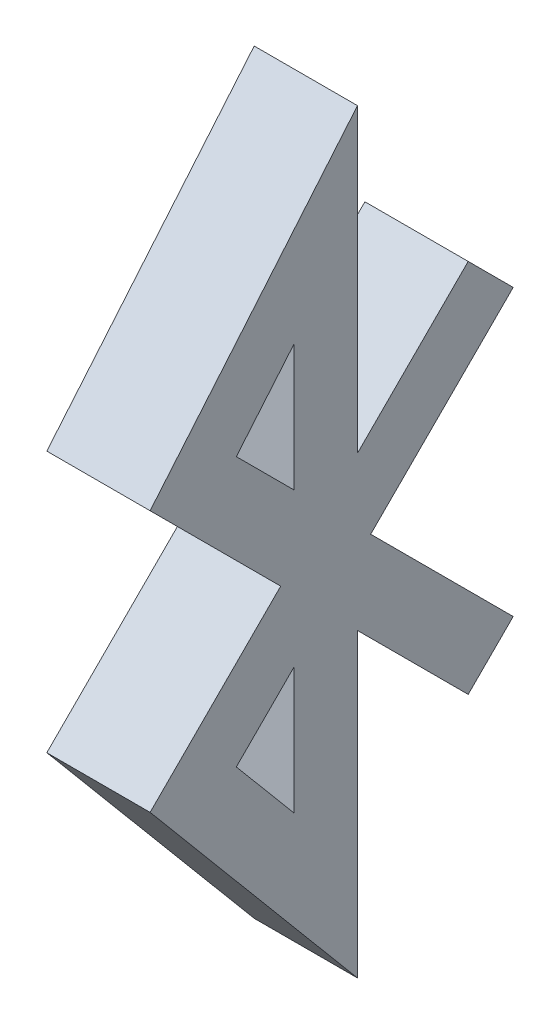
ISO-10303-21;
HEADER;
FILE_DESCRIPTION(('STEP AP214'),'2;1');
FILE_NAME('part.step','',(''),(''),'','','');
FILE_SCHEMA(('AUTOMOTIVE_DESIGN { 1 0 10303 214 1 1 1 1 }'));
ENDSEC;
DATA;
#1=APPLICATION_CONTEXT('core data for automotive mechanical design processes');
#2=APPLICATION_PROTOCOL_DEFINITION('international standard','automotive_design',2000,#1);
#3=PRODUCT_CONTEXT('',#1,'mechanical');
#4=PRODUCT('Part','Part','',(#3));
#5=PRODUCT_RELATED_PRODUCT_CATEGORY('part','',(#4));
#6=PRODUCT_DEFINITION_FORMATION('','',#4);
#7=PRODUCT_DEFINITION_CONTEXT('part definition',#1,'design');
#8=PRODUCT_DEFINITION('design','',#6,#7);
#9=PRODUCT_DEFINITION_SHAPE('','',#8);
#10=(LENGTH_UNIT() NAMED_UNIT(*) SI_UNIT(.MILLI.,.METRE.));
#11=(NAMED_UNIT(*) PLANE_ANGLE_UNIT() SI_UNIT($,.RADIAN.));
#12=(NAMED_UNIT(*) SI_UNIT($,.STERADIAN.) SOLID_ANGLE_UNIT());
#13=UNCERTAINTY_MEASURE_WITH_UNIT(LENGTH_MEASURE(1.E-05),#10,'distance_accuracy_value','');
#14=(GEOMETRIC_REPRESENTATION_CONTEXT(3) GLOBAL_UNCERTAINTY_ASSIGNED_CONTEXT((#13)) GLOBAL_UNIT_ASSIGNED_CONTEXT((#10,
#11,#12)) REPRESENTATION_CONTEXT('',''));
#15=CARTESIAN_POINT('',(0.,0.,0.));
#16=DIRECTION('',(0.,0.,1.));
#17=DIRECTION('',(1.,0.,0.));
#18=AXIS2_PLACEMENT_3D('',#15,#16,#17);
#19=CARTESIAN_POINT('',(-97.7869829373561,38.7791698484324,-0.465579749400182));
#20=DIRECTION('',(0.,0.,-1.));
#21=DIRECTION('',(-1.,0.,0.));
#22=AXIS2_PLACEMENT_3D('',#19,#20,#21);
#23=PLANE('',#22);
#24=DIRECTION('',(0.,-1.,0.));
#25=VECTOR('',#24,1.);
#26=CARTESIAN_POINT('',(-99.299,38.7791698484324,-0.465579749400182));
#27=LINE('',#26,#25);
#28=CARTESIAN_POINT('',(-99.299,38.7791698484324,-0.465579749400182));
#29=VERTEX_POINT('',#28);
#30=CARTESIAN_POINT('',(-99.299,34.3740089453682,-0.465579749400176));
#31=VERTEX_POINT('',#30);
#32=EDGE_CURVE('E194',#29,#31,#27,.T.);
#33=ORIENTED_EDGE('',*,*,#32,.F.);
#34=DIRECTION('',(-1.,0.,0.));
#35=VECTOR('',#34,1.);
#36=CARTESIAN_POINT('',(-97.7869829373561,38.7791698484324,-0.465579749400182));
#37=LINE('',#36,#35);
#38=CARTESIAN_POINT('',(-97.7869829373561,38.7791698484324,-0.465579749400182));
#39=VERTEX_POINT('',#38);
#40=EDGE_CURVE('E35',#39,#29,#37,.T.);
#41=ORIENTED_EDGE('',*,*,#40,.F.);
#42=DIRECTION('',(0.,-1.,0.));
#43=VECTOR('',#42,1.);
#44=CARTESIAN_POINT('',(-97.7869829373561,38.7791698484324,-0.465579749400182));
#45=LINE('',#44,#43);
#46=CARTESIAN_POINT('',(-97.7869829373561,34.3740089453682,-0.465579749400176));
#47=VERTEX_POINT('',#46);
#48=EDGE_CURVE('E280',#39,#47,#45,.T.);
#49=ORIENTED_EDGE('',*,*,#48,.T.);
#50=DIRECTION('',(-1.,0.,0.));
#51=VECTOR('',#50,1.);
#52=CARTESIAN_POINT('',(-97.7869829373561,34.3740089453682,-0.465579749400176));
#53=LINE('',#52,#51);
#54=EDGE_CURVE('E10',#47,#31,#53,.T.);
#55=ORIENTED_EDGE('',*,*,#54,.T.);
#56=EDGE_LOOP('',(#33,#41,#49,#55));
#57=FACE_BOUND('',#56,.T.);
#58=ADVANCED_FACE('F16',(#57),#23,.T.);
#59=CARTESIAN_POINT('',(-97.7869829373561,34.3740089453682,-0.465579749400176));
#60=DIRECTION('',(0.,0.707106781186544,0.707106781186551));
#61=DIRECTION('',(0.,-0.707106781186551,0.707106781186544));
#62=AXIS2_PLACEMENT_3D('',#59,#60,#61);
#63=PLANE('',#62);
#64=DIRECTION('',(0.,0.707106781186551,-0.707106781186544));
#65=VECTOR('',#64,1.);
#66=CARTESIAN_POINT('',(-99.299,34.3740089453682,-0.465579749400176));
#67=LINE('',#66,#65);
#68=CARTESIAN_POINT('',(-99.299,35.9943942004683,-2.0859650045003));
#69=VERTEX_POINT('',#68);
#70=EDGE_CURVE('E197',#31,#69,#67,.T.);
#71=ORIENTED_EDGE('',*,*,#70,.F.);
#72=ORIENTED_EDGE('',*,*,#54,.F.);
#73=DIRECTION('',(0.,0.707106781186551,-0.707106781186544));
#74=VECTOR('',#73,1.);
#75=CARTESIAN_POINT('',(-97.7869829373561,34.3740089453682,-0.465579749400176));
#76=LINE('',#75,#74);
#77=CARTESIAN_POINT('',(-97.7869829373561,35.9943942004683,-2.0859650045003));
#78=VERTEX_POINT('',#77);
#79=EDGE_CURVE('E282',#47,#78,#76,.T.);
#80=ORIENTED_EDGE('',*,*,#79,.T.);
#81=DIRECTION('',(-1.,0.,0.));
#82=VECTOR('',#81,1.);
#83=CARTESIAN_POINT('',(-97.7869829373561,35.9943942004683,-2.0859650045003));
#84=LINE('',#83,#82);
#85=EDGE_CURVE('E26',#78,#69,#84,.T.);
#86=ORIENTED_EDGE('',*,*,#85,.T.);
#87=EDGE_LOOP('',(#71,#72,#80,#86));
#88=FACE_BOUND('',#87,.T.);
#89=ADVANCED_FACE('F332',(#88),#63,.T.);
#90=CARTESIAN_POINT('',(-97.7869829373561,35.9943942004683,-2.0859650045003));
#91=DIRECTION('',(0.,0.707106781186551,-0.707106781186544));
#92=DIRECTION('',(0.,0.707106781186544,0.707106781186551));
#93=AXIS2_PLACEMENT_3D('',#90,#91,#92);
#94=PLANE('',#93);
#95=DIRECTION('',(0.,-0.707106781186544,-0.707106781186551));
#96=VECTOR('',#95,1.);
#97=CARTESIAN_POINT('',(-99.299,35.9943942004683,-2.0859650045003));
#98=LINE('',#97,#96);
#99=CARTESIAN_POINT('',(-99.299,35.3359650045003,-2.7443942004683));
#100=VERTEX_POINT('',#99);
#101=EDGE_CURVE('E200',#69,#100,#98,.T.);
#102=ORIENTED_EDGE('',*,*,#101,.F.);
#103=ORIENTED_EDGE('',*,*,#85,.F.);
#104=DIRECTION('',(0.,-0.707106781186544,-0.707106781186551));
#105=VECTOR('',#104,1.);
#106=CARTESIAN_POINT('',(-97.7869829373561,35.9943942004683,-2.0859650045003));
#107=LINE('',#106,#105);
#108=CARTESIAN_POINT('',(-97.7869829373561,35.3359650045003,-2.7443942004683));
#109=VERTEX_POINT('',#108);
#110=EDGE_CURVE('E285',#78,#109,#107,.T.);
#111=ORIENTED_EDGE('',*,*,#110,.T.);
#112=DIRECTION('',(-1.,0.,0.));
#113=VECTOR('',#112,1.);
#114=CARTESIAN_POINT('',(-97.7869829373561,35.3359650045003,-2.7443942004683));
#115=LINE('',#114,#113);
#116=EDGE_CURVE('E241',#109,#100,#115,.T.);
#117=ORIENTED_EDGE('',*,*,#116,.T.);
#118=EDGE_LOOP('',(#102,#103,#111,#117));
#119=FACE_BOUND('',#118,.T.);
#120=ADVANCED_FACE('F328',(#119),#94,.T.);
#121=CARTESIAN_POINT('',(-97.7869829373561,35.3359650045003,-2.7443942004683));
#122=DIRECTION('',(0.,-0.707106781186544,-0.707106781186551));
#123=DIRECTION('',(0.,0.707106781186551,-0.707106781186544));
#124=AXIS2_PLACEMENT_3D('',#121,#122,#123);
#125=PLANE('',#124);
#126=DIRECTION('',(0.,-0.707106781186551,0.707106781186544));
#127=VECTOR('',#126,1.);
#128=CARTESIAN_POINT('',(-99.299,35.3359650045003,-2.7443942004683));
#129=LINE('',#128,#127);
#130=CARTESIAN_POINT('',(-99.299,33.25,-0.658429195968));
#131=VERTEX_POINT('',#130);
#132=EDGE_CURVE('E203',#100,#131,#129,.T.);
#133=ORIENTED_EDGE('',*,*,#132,.F.);
#134=ORIENTED_EDGE('',*,*,#116,.F.);
#135=DIRECTION('',(0.,-0.707106781186551,0.707106781186544));
#136=VECTOR('',#135,1.);
#137=CARTESIAN_POINT('',(-97.7869829373561,35.3359650045003,-2.7443942004683));
#138=LINE('',#137,#136);
#139=CARTESIAN_POINT('',(-97.7869829373561,33.25,-0.658429195968001));
#140=VERTEX_POINT('',#139);
#141=EDGE_CURVE('E288',#109,#140,#138,.T.);
#142=ORIENTED_EDGE('',*,*,#141,.T.);
#143=DIRECTION('',(-1.,0.,0.));
#144=VECTOR('',#143,1.);
#145=CARTESIAN_POINT('',(-97.7869829373561,33.25,-0.658429195968001));
#146=LINE('',#145,#144);
#147=EDGE_CURVE('E239',#140,#131,#146,.T.);
#148=ORIENTED_EDGE('',*,*,#147,.T.);
#149=EDGE_LOOP('',(#133,#134,#142,#148));
#150=FACE_BOUND('',#149,.T.);
#151=ADVANCED_FACE('F325',(#150),#125,.T.);
#152=CARTESIAN_POINT('',(-97.7869829373561,33.25,-0.658429195968001));
#153=DIRECTION('',(0.,0.707106781186551,-0.707106781186544));
#154=DIRECTION('',(0.,0.707106781186544,0.707106781186551));
#155=AXIS2_PLACEMENT_3D('',#152,#153,#154);
#156=PLANE('',#155);
#157=DIRECTION('',(0.,-0.707106781186544,-0.707106781186551));
#158=VECTOR('',#157,1.);
#159=CARTESIAN_POINT('',(-99.299,33.25,-0.658429195968));
#160=LINE('',#159,#158);
#161=CARTESIAN_POINT('',(-99.299,31.1640349954997,-2.7443942004683));
#162=VERTEX_POINT('',#161);
#163=EDGE_CURVE('E206',#131,#162,#160,.T.);
#164=ORIENTED_EDGE('',*,*,#163,.F.);
#165=ORIENTED_EDGE('',*,*,#147,.F.);
#166=DIRECTION('',(0.,-0.707106781186544,-0.707106781186551));
#167=VECTOR('',#166,1.);
#168=CARTESIAN_POINT('',(-97.7869829373561,33.25,-0.658429195968001));
#169=LINE('',#168,#167);
#170=CARTESIAN_POINT('',(-97.7869829373561,31.1640349954997,-2.7443942004683));
#171=VERTEX_POINT('',#170);
#172=EDGE_CURVE('E291',#140,#171,#169,.T.);
#173=ORIENTED_EDGE('',*,*,#172,.T.);
#174=DIRECTION('',(-1.,0.,0.));
#175=VECTOR('',#174,1.);
#176=CARTESIAN_POINT('',(-97.7869829373561,31.1640349954997,-2.7443942004683));
#177=LINE('',#176,#175);
#178=EDGE_CURVE('E237',#171,#162,#177,.T.);
#179=ORIENTED_EDGE('',*,*,#178,.T.);
#180=EDGE_LOOP('',(#164,#165,#173,#179));
#181=FACE_BOUND('',#180,.T.);
#182=ADVANCED_FACE('F322',(#181),#156,.T.);
#183=CARTESIAN_POINT('',(-97.7869829373561,31.1640349954997,-2.7443942004683));
#184=DIRECTION('',(0.,-0.707106781186544,-0.707106781186551));
#185=DIRECTION('',(0.,0.707106781186551,-0.707106781186544));
#186=AXIS2_PLACEMENT_3D('',#183,#184,#185);
#187=PLANE('',#186);
#188=DIRECTION('',(0.,-0.707106781186551,0.707106781186544));
#189=VECTOR('',#188,1.);
#190=CARTESIAN_POINT('',(-99.299,31.1640349954997,-2.7443942004683));
#191=LINE('',#190,#189);
#192=CARTESIAN_POINT('',(-99.299,30.5056057995317,-2.0859650045003));
#193=VERTEX_POINT('',#192);
#194=EDGE_CURVE('E209',#162,#193,#191,.T.);
#195=ORIENTED_EDGE('',*,*,#194,.F.);
#196=ORIENTED_EDGE('',*,*,#178,.F.);
#197=DIRECTION('',(0.,-0.707106781186551,0.707106781186544));
#198=VECTOR('',#197,1.);
#199=CARTESIAN_POINT('',(-97.7869829373561,31.1640349954997,-2.7443942004683));
#200=LINE('',#199,#198);
#201=CARTESIAN_POINT('',(-97.7869829373561,30.5056057995317,-2.0859650045003));
#202=VERTEX_POINT('',#201);
#203=EDGE_CURVE('E294',#171,#202,#200,.T.);
#204=ORIENTED_EDGE('',*,*,#203,.T.);
#205=DIRECTION('',(-1.,0.,0.));
#206=VECTOR('',#205,1.);
#207=CARTESIAN_POINT('',(-97.7869829373561,30.5056057995317,-2.0859650045003));
#208=LINE('',#207,#206);
#209=EDGE_CURVE('E235',#202,#193,#208,.T.);
#210=ORIENTED_EDGE('',*,*,#209,.T.);
#211=EDGE_LOOP('',(#195,#196,#204,#210));
#212=FACE_BOUND('',#211,.T.);
#213=ADVANCED_FACE('F316',(#212),#187,.T.);
#214=CARTESIAN_POINT('',(-97.7869829373561,30.5056057995317,-2.0859650045003));
#215=DIRECTION('',(0.,-0.707106781186551,0.707106781186544));
#216=DIRECTION('',(0.,-0.707106781186544,-0.707106781186551));
#217=AXIS2_PLACEMENT_3D('',#214,#215,#216);
#218=PLANE('',#217);
#219=DIRECTION('',(0.,0.707106781186544,0.707106781186551));
#220=VECTOR('',#219,1.);
#221=CARTESIAN_POINT('',(-99.299,30.5056057995317,-2.0859650045003));
#222=LINE('',#221,#220);
#223=CARTESIAN_POINT('',(-99.299,32.1259910546318,-0.46557974940018));
#224=VERTEX_POINT('',#223);
#225=EDGE_CURVE('E212',#193,#224,#222,.T.);
#226=ORIENTED_EDGE('',*,*,#225,.F.);
#227=ORIENTED_EDGE('',*,*,#209,.F.);
#228=DIRECTION('',(0.,0.707106781186544,0.707106781186551));
#229=VECTOR('',#228,1.);
#230=CARTESIAN_POINT('',(-97.7869829373561,30.5056057995317,-2.0859650045003));
#231=LINE('',#230,#229);
#232=CARTESIAN_POINT('',(-97.7869829373561,32.1259910546318,-0.465579749400181));
#233=VERTEX_POINT('',#232);
#234=EDGE_CURVE('E297',#202,#233,#231,.T.);
#235=ORIENTED_EDGE('',*,*,#234,.T.);
#236=DIRECTION('',(-1.,0.,0.));
#237=VECTOR('',#236,1.);
#238=CARTESIAN_POINT('',(-97.7869829373561,32.1259910546318,-0.465579749400181));
#239=LINE('',#238,#237);
#240=EDGE_CURVE('E233',#233,#224,#239,.T.);
#241=ORIENTED_EDGE('',*,*,#240,.T.);
#242=EDGE_LOOP('',(#226,#227,#235,#241));
#243=FACE_BOUND('',#242,.T.);
#244=ADVANCED_FACE('F313',(#243),#218,.T.);
#245=CARTESIAN_POINT('',(-97.7869829373561,32.1259910546318,-0.465579749400181));
#246=DIRECTION('',(0.,0.,-1.));
#247=DIRECTION('',(-1.,0.,0.));
#248=AXIS2_PLACEMENT_3D('',#245,#246,#247);
#249=PLANE('',#248);
#250=DIRECTION('',(0.,-1.,0.));
#251=VECTOR('',#250,1.);
#252=CARTESIAN_POINT('',(-99.299,32.1259910546318,-0.46557974940018));
#253=LINE('',#252,#251);
#254=CARTESIAN_POINT('',(-99.299,27.7208301515677,-0.465579749400175));
#255=VERTEX_POINT('',#254);
#256=EDGE_CURVE('E215',#224,#255,#253,.T.);
#257=ORIENTED_EDGE('',*,*,#256,.F.);
#258=ORIENTED_EDGE('',*,*,#240,.F.);
#259=DIRECTION('',(0.,-1.,0.));
#260=VECTOR('',#259,1.);
#261=CARTESIAN_POINT('',(-97.7869829373561,32.1259910546318,-0.465579749400181));
#262=LINE('',#261,#260);
#263=CARTESIAN_POINT('',(-97.7869829373561,27.7208301515677,-0.465579749400175));
#264=VERTEX_POINT('',#263);
#265=EDGE_CURVE('E300',#233,#264,#262,.T.);
#266=ORIENTED_EDGE('',*,*,#265,.T.);
#267=DIRECTION('',(-1.,0.,0.));
#268=VECTOR('',#267,1.);
#269=CARTESIAN_POINT('',(-97.7869829373561,27.7208301515677,-0.465579749400175));
#270=LINE('',#269,#268);
#271=EDGE_CURVE('E231',#264,#255,#270,.T.);
#272=ORIENTED_EDGE('',*,*,#271,.T.);
#273=EDGE_LOOP('',(#257,#258,#266,#272));
#274=FACE_BOUND('',#273,.T.);
#275=ADVANCED_FACE('F310',(#274),#249,.T.);
#276=CARTESIAN_POINT('',(-97.7869829373561,27.7208301515677,-0.465579749400175));
#277=DIRECTION('',(0.,-0.642787609686541,0.766044443118976));
#278=DIRECTION('',(0.,-0.766044443118976,-0.642787609686541));
#279=AXIS2_PLACEMENT_3D('',#276,#277,#278);
#280=PLANE('',#279);
#281=DIRECTION('',(0.,0.766044443118976,0.642787609686541));
#282=VECTOR('',#281,1.);
#283=CARTESIAN_POINT('',(-99.299,27.7208301515677,-0.465579749400175));
#284=LINE('',#283,#282);
#285=CARTESIAN_POINT('',(-99.299,31.3384584089022,2.56997078706576));
#286=VERTEX_POINT('',#285);
#287=EDGE_CURVE('E218',#255,#286,#284,.T.);
#288=ORIENTED_EDGE('',*,*,#287,.F.);
#289=ORIENTED_EDGE('',*,*,#271,.F.);
#290=DIRECTION('',(0.,0.766044443118976,0.642787609686541));
#291=VECTOR('',#290,1.);
#292=CARTESIAN_POINT('',(-97.7869829373561,27.7208301515677,-0.465579749400175));
#293=LINE('',#292,#291);
#294=CARTESIAN_POINT('',(-97.7869829373561,31.3384584089022,2.56997078706576));
#295=VERTEX_POINT('',#294);
#296=EDGE_CURVE('E166',#264,#295,#293,.T.);
#297=ORIENTED_EDGE('',*,*,#296,.T.);
#298=DIRECTION('',(-1.,0.,0.));
#299=VECTOR('',#298,1.);
#300=CARTESIAN_POINT('',(-97.7869829373561,31.3384584089022,2.56997078706576));
#301=LINE('',#300,#299);
#302=EDGE_CURVE('E158',#295,#286,#301,.T.);
#303=ORIENTED_EDGE('',*,*,#302,.T.);
#304=EDGE_LOOP('',(#288,#289,#297,#303));
#305=FACE_BOUND('',#304,.T.);
#306=ADVANCED_FACE('F304',(#305),#280,.T.);
#307=CARTESIAN_POINT('',(-97.7869829373561,31.3384584089022,2.56997078706576));
#308=DIRECTION('',(0.,0.707106781186544,0.707106781186551));
#309=DIRECTION('',(0.,-0.707106781186551,0.707106781186544));
#310=AXIS2_PLACEMENT_3D('',#307,#308,#309);
#311=PLANE('',#310);
#312=DIRECTION('',(0.,0.707106781186551,-0.707106781186544));
#313=VECTOR('',#312,1.);
#314=CARTESIAN_POINT('',(-99.299,31.3384584089022,2.56997078706576));
#315=LINE('',#314,#313);
#316=CARTESIAN_POINT('',(-99.299,33.25,0.658429195968008));
#317=VERTEX_POINT('',#316);
#318=EDGE_CURVE('E221',#286,#317,#315,.T.);
#319=ORIENTED_EDGE('',*,*,#318,.F.);
#320=ORIENTED_EDGE('',*,*,#302,.F.);
#321=DIRECTION('',(0.,0.707106781186551,-0.707106781186544));
#322=VECTOR('',#321,1.);
#323=CARTESIAN_POINT('',(-97.7869829373561,31.3384584089022,2.56997078706576));
#324=LINE('',#323,#322);
#325=CARTESIAN_POINT('',(-97.7869829373561,33.25,0.658429195968007));
#326=VERTEX_POINT('',#325);
#327=EDGE_CURVE('E161',#295,#326,#324,.T.);
#328=ORIENTED_EDGE('',*,*,#327,.T.);
#329=DIRECTION('',(-1.,0.,0.));
#330=VECTOR('',#329,1.);
#331=CARTESIAN_POINT('',(-97.7869829373561,33.25,0.658429195968007));
#332=LINE('',#331,#330);
#333=EDGE_CURVE('E147',#326,#317,#332,.T.);
#334=ORIENTED_EDGE('',*,*,#333,.T.);
#335=EDGE_LOOP('',(#319,#320,#328,#334));
#336=FACE_BOUND('',#335,.T.);
#337=ADVANCED_FACE('F162',(#336),#311,.T.);
#338=CARTESIAN_POINT('',(-97.7869829373561,33.25,0.658429195968007));
#339=DIRECTION('',(0.,-0.707106781186551,0.707106781186544));
#340=DIRECTION('',(0.,-0.707106781186544,-0.707106781186551));
#341=AXIS2_PLACEMENT_3D('',#338,#339,#340);
#342=PLANE('',#341);
#343=DIRECTION('',(0.,0.707106781186544,0.707106781186551));
#344=VECTOR('',#343,1.);
#345=CARTESIAN_POINT('',(-99.299,33.25,0.658429195968008));
#346=LINE('',#345,#344);
#347=CARTESIAN_POINT('',(-99.299,35.1615415910978,2.56997078706577));
#348=VERTEX_POINT('',#347);
#349=EDGE_CURVE('E154',#317,#348,#346,.T.);
#350=ORIENTED_EDGE('',*,*,#349,.F.);
#351=ORIENTED_EDGE('',*,*,#333,.F.);
#352=DIRECTION('',(0.,0.707106781186544,0.707106781186551));
#353=VECTOR('',#352,1.);
#354=CARTESIAN_POINT('',(-97.7869829373561,33.25,0.658429195968007));
#355=LINE('',#354,#353);
#356=CARTESIAN_POINT('',(-97.7869829373561,35.1615415910978,2.56997078706577));
#357=VERTEX_POINT('',#356);
#358=EDGE_CURVE('E151',#326,#357,#355,.T.);
#359=ORIENTED_EDGE('',*,*,#358,.T.);
#360=DIRECTION('',(-1.,0.,0.));
#361=VECTOR('',#360,1.);
#362=CARTESIAN_POINT('',(-97.7869829373561,35.1615415910978,2.56997078706577));
#363=LINE('',#362,#361);
#364=EDGE_CURVE('E93',#357,#348,#363,.T.);
#365=ORIENTED_EDGE('',*,*,#364,.T.);
#366=EDGE_LOOP('',(#350,#351,#359,#365));
#367=FACE_BOUND('',#366,.T.);
#368=ADVANCED_FACE('F149',(#367),#342,.T.);
#369=CARTESIAN_POINT('',(-97.7869829373561,36.2208301515677,0.465579749400182));
#370=DIRECTION('',(0.,-0.642787609686535,-0.766044443118982));
#371=DIRECTION('',(0.,0.766044443118982,-0.642787609686535));
#372=AXIS2_PLACEMENT_3D('',#369,#370,#371);
#373=PLANE('',#372);
#374=DIRECTION('',(0.,-0.766044443118982,0.642787609686535));
#375=VECTOR('',#374,1.);
#376=CARTESIAN_POINT('',(-99.299,36.2208301515677,0.465579749400182));
#377=LINE('',#376,#375);
#378=CARTESIAN_POINT('',(-99.299,36.2208301515677,0.465579749400182));
#379=VERTEX_POINT('',#378);
#380=CARTESIAN_POINT('',(-99.299,35.2166315889171,1.30820239294906));
#381=VERTEX_POINT('',#380);
#382=EDGE_CURVE('E185',#379,#381,#377,.T.);
#383=ORIENTED_EDGE('',*,*,#382,.F.);
#384=DIRECTION('',(-1.,0.,0.));
#385=VECTOR('',#384,1.);
#386=CARTESIAN_POINT('',(-97.7869829373561,36.2208301515677,0.465579749400181));
#387=LINE('',#386,#385);
#388=CARTESIAN_POINT('',(-97.7869829373561,36.2208301515677,0.465579749400181));
#389=VERTEX_POINT('',#388);
#390=EDGE_CURVE('E244',#389,#379,#387,.T.);
#391=ORIENTED_EDGE('',*,*,#390,.F.);
#392=DIRECTION('',(0.,-0.766044443118982,0.642787609686535));
#393=VECTOR('',#392,1.);
#394=CARTESIAN_POINT('',(-97.7869829373561,36.2208301515677,0.465579749400182));
#395=LINE('',#394,#393);
#396=CARTESIAN_POINT('',(-97.7869829373561,35.2166315889171,1.30820239294906));
#397=VERTEX_POINT('',#396);
#398=EDGE_CURVE('E265',#389,#397,#395,.T.);
#399=ORIENTED_EDGE('',*,*,#398,.T.);
#400=DIRECTION('',(-1.,0.,0.));
#401=VECTOR('',#400,1.);
#402=CARTESIAN_POINT('',(-97.7869829373561,35.2166315889171,1.30820239294906));
#403=LINE('',#402,#401);
#404=EDGE_CURVE('E228',#397,#381,#403,.T.);
#405=ORIENTED_EDGE('',*,*,#404,.T.);
#406=EDGE_LOOP('',(#383,#391,#399,#405));
#407=FACE_BOUND('',#406,.T.);
#408=ADVANCED_FACE('F361',(#407),#373,.T.);
#409=CARTESIAN_POINT('',(-97.7869829373561,35.2166315889171,1.30820239294906));
#410=DIRECTION('',(0.,0.707106781186551,-0.707106781186544));
#411=DIRECTION('',(0.,0.707106781186544,0.707106781186551));
#412=AXIS2_PLACEMENT_3D('',#409,#410,#411);
#413=PLANE('',#412);
#414=DIRECTION('',(0.,-0.707106781186544,-0.707106781186551));
#415=VECTOR('',#414,1.);
#416=CARTESIAN_POINT('',(-99.299,35.2166315889171,1.30820239294906));
#417=LINE('',#416,#415);
#418=CARTESIAN_POINT('',(-99.299,34.3740089453682,0.465579749400183));
#419=VERTEX_POINT('',#418);
#420=EDGE_CURVE('E188',#381,#419,#417,.T.);
#421=ORIENTED_EDGE('',*,*,#420,.F.);
#422=ORIENTED_EDGE('',*,*,#404,.F.);
#423=DIRECTION('',(0.,-0.707106781186544,-0.707106781186551));
#424=VECTOR('',#423,1.);
#425=CARTESIAN_POINT('',(-97.7869829373561,35.2166315889171,1.30820239294906));
#426=LINE('',#425,#424);
#427=CARTESIAN_POINT('',(-97.7869829373561,34.3740089453682,0.465579749400183));
#428=VERTEX_POINT('',#427);
#429=EDGE_CURVE('E274',#397,#428,#426,.T.);
#430=ORIENTED_EDGE('',*,*,#429,.T.);
#431=DIRECTION('',(-1.,0.,0.));
#432=VECTOR('',#431,1.);
#433=CARTESIAN_POINT('',(-97.7869829373561,34.3740089453682,0.465579749400183));
#434=LINE('',#433,#432);
#435=EDGE_CURVE('E246',#428,#419,#434,.T.);
#436=ORIENTED_EDGE('',*,*,#435,.T.);
#437=EDGE_LOOP('',(#421,#422,#430,#436));
#438=FACE_BOUND('',#437,.T.);
#439=ADVANCED_FACE('F358',(#438),#413,.T.);
#440=CARTESIAN_POINT('',(-97.7869829373561,31.2833684110829,1.30820239294905));
#441=DIRECTION('',(0.,0.642787609686541,-0.766044443118976));
#442=DIRECTION('',(0.,0.766044443118976,0.642787609686541));
#443=AXIS2_PLACEMENT_3D('',#440,#441,#442);
#444=PLANE('',#443);
#445=DIRECTION('',(0.,-0.766044443118976,-0.642787609686541));
#446=VECTOR('',#445,1.);
#447=CARTESIAN_POINT('',(-99.299,31.2833684110829,1.30820239294905));
#448=LINE('',#447,#446);
#449=CARTESIAN_POINT('',(-99.299,31.2833684110829,1.30820239294905));
#450=VERTEX_POINT('',#449);
#451=CARTESIAN_POINT('',(-99.299,30.2791698484324,0.465579749400184));
#452=VERTEX_POINT('',#451);
#453=EDGE_CURVE('E176',#450,#452,#448,.T.);
#454=ORIENTED_EDGE('',*,*,#453,.F.);
#455=DIRECTION('',(-1.,0.,0.));
#456=VECTOR('',#455,1.);
#457=CARTESIAN_POINT('',(-97.7869829373561,31.2833684110829,1.30820239294905));
#458=LINE('',#457,#456);
#459=CARTESIAN_POINT('',(-97.7869829373561,31.2833684110829,1.30820239294905));
#460=VERTEX_POINT('',#459);
#461=EDGE_CURVE('E172',#460,#450,#458,.T.);
#462=ORIENTED_EDGE('',*,*,#461,.F.);
#463=DIRECTION('',(0.,-0.766044443118976,-0.642787609686541));
#464=VECTOR('',#463,1.);
#465=CARTESIAN_POINT('',(-97.7869829373561,31.2833684110829,1.30820239294905));
#466=LINE('',#465,#464);
#467=CARTESIAN_POINT('',(-97.7869829373561,30.2791698484324,0.465579749400183));
#468=VERTEX_POINT('',#467);
#469=EDGE_CURVE('E226',#460,#468,#466,.T.);
#470=ORIENTED_EDGE('',*,*,#469,.T.);
#471=DIRECTION('',(-1.,0.,0.));
#472=VECTOR('',#471,1.);
#473=CARTESIAN_POINT('',(-97.7869829373561,30.2791698484324,0.465579749400183));
#474=LINE('',#473,#472);
#475=EDGE_CURVE('E20',#468,#452,#474,.T.);
#476=ORIENTED_EDGE('',*,*,#475,.T.);
#477=EDGE_LOOP('',(#454,#462,#470,#476));
#478=FACE_BOUND('',#477,.T.);
#479=ADVANCED_FACE('F18',(#478),#444,.T.);
#480=CARTESIAN_POINT('',(-97.7869829373561,30.2791698484324,0.465579749400183));
#481=DIRECTION('',(0.,0.,1.));
#482=DIRECTION('',(1.,0.,0.));
#483=AXIS2_PLACEMENT_3D('',#480,#481,#482);
#484=PLANE('',#483);
#485=DIRECTION('',(0.,1.,0.));
#486=VECTOR('',#485,1.);
#487=CARTESIAN_POINT('',(-99.299,30.2791698484324,0.465579749400184));
#488=LINE('',#487,#486);
#489=CARTESIAN_POINT('',(-99.299,32.1259910546318,0.465579749400185));
#490=VERTEX_POINT('',#489);
#491=EDGE_CURVE('E179',#452,#490,#488,.T.);
#492=ORIENTED_EDGE('',*,*,#491,.F.);
#493=ORIENTED_EDGE('',*,*,#475,.F.);
#494=DIRECTION('',(0.,1.,0.));
#495=VECTOR('',#494,1.);
#496=CARTESIAN_POINT('',(-97.7869829373561,30.2791698484324,0.465579749400183));
#497=LINE('',#496,#495);
#498=CARTESIAN_POINT('',(-97.7869829373561,32.1259910546318,0.465579749400184));
#499=VERTEX_POINT('',#498);
#500=EDGE_CURVE('E266',#468,#499,#497,.T.);
#501=ORIENTED_EDGE('',*,*,#500,.T.);
#502=DIRECTION('',(-1.,0.,0.));
#503=VECTOR('',#502,1.);
#504=CARTESIAN_POINT('',(-97.7869829373561,32.1259910546318,0.465579749400184));
#505=LINE('',#504,#503);
#506=EDGE_CURVE('E249',#499,#490,#505,.T.);
#507=ORIENTED_EDGE('',*,*,#506,.T.);
#508=EDGE_LOOP('',(#492,#493,#501,#507));
#509=FACE_BOUND('',#508,.T.);
#510=ADVANCED_FACE('F255',(#509),#484,.T.);
#511=CARTESIAN_POINT('',(-97.7869829373561,34.3740089453682,0.465579749400183));
#512=DIRECTION('',(0.,0.,1.));
#513=DIRECTION('',(1.,0.,0.));
#514=AXIS2_PLACEMENT_3D('',#511,#512,#513);
#515=PLANE('',#514);
#516=DIRECTION('',(0.,1.,0.));
#517=VECTOR('',#516,1.);
#518=CARTESIAN_POINT('',(-99.299,34.3740089453682,0.465579749400183));
#519=LINE('',#518,#517);
#520=EDGE_CURVE('E191',#419,#379,#519,.T.);
#521=ORIENTED_EDGE('',*,*,#520,.F.);
#522=ORIENTED_EDGE('',*,*,#435,.F.);
#523=DIRECTION('',(0.,1.,0.));
#524=VECTOR('',#523,1.);
#525=CARTESIAN_POINT('',(-97.7869829373561,34.3740089453682,0.465579749400183));
#526=LINE('',#525,#524);
#527=EDGE_CURVE('E277',#428,#389,#526,.T.);
#528=ORIENTED_EDGE('',*,*,#527,.T.);
#529=ORIENTED_EDGE('',*,*,#390,.T.);
#530=EDGE_LOOP('',(#521,#522,#528,#529));
#531=FACE_BOUND('',#530,.T.);
#532=ADVANCED_FACE('F343',(#531),#515,.T.);
#533=CARTESIAN_POINT('',(-97.7869829373561,32.1259910546318,0.465579749400185));
#534=DIRECTION('',(0.,-0.707106781186544,-0.707106781186551));
#535=DIRECTION('',(0.,0.707106781186551,-0.707106781186544));
#536=AXIS2_PLACEMENT_3D('',#533,#534,#535);
#537=PLANE('',#536);
#538=DIRECTION('',(0.,-0.707106781186551,0.707106781186544));
#539=VECTOR('',#538,1.);
#540=CARTESIAN_POINT('',(-99.299,32.1259910546318,0.465579749400185));
#541=LINE('',#540,#539);
#542=EDGE_CURVE('E182',#490,#450,#541,.T.);
#543=ORIENTED_EDGE('',*,*,#542,.F.);
#544=ORIENTED_EDGE('',*,*,#506,.F.);
#545=DIRECTION('',(0.,-0.707106781186551,0.707106781186544));
#546=VECTOR('',#545,1.);
#547=CARTESIAN_POINT('',(-97.7869829373561,32.1259910546318,0.465579749400185));
#548=LINE('',#547,#546);
#549=EDGE_CURVE('E263',#499,#460,#548,.T.);
#550=ORIENTED_EDGE('',*,*,#549,.T.);
#551=ORIENTED_EDGE('',*,*,#461,.T.);
#552=EDGE_LOOP('',(#543,#544,#550,#551));
#553=FACE_BOUND('',#552,.T.);
#554=ADVANCED_FACE('F260',(#553),#537,.T.);
#555=CARTESIAN_POINT('',(-97.7869829373561,35.1615415910978,2.56997078706577));
#556=DIRECTION('',(0.,0.642787609686535,0.766044443118982));
#557=DIRECTION('',(0.,-0.766044443118982,0.642787609686535));
#558=AXIS2_PLACEMENT_3D('',#555,#556,#557);
#559=PLANE('',#558);
#560=DIRECTION('',(0.,0.766044443118982,-0.642787609686535));
#561=VECTOR('',#560,1.);
#562=CARTESIAN_POINT('',(-99.299,35.1615415910978,2.56997078706577));
#563=LINE('',#562,#561);
#564=EDGE_CURVE('E224',#348,#29,#563,.T.);
#565=ORIENTED_EDGE('',*,*,#564,.F.);
#566=ORIENTED_EDGE('',*,*,#364,.F.);
#567=DIRECTION('',(0.,0.766044443118982,-0.642787609686535));
#568=VECTOR('',#567,1.);
#569=CARTESIAN_POINT('',(-97.7869829373561,35.1615415910978,2.56997078706577));
#570=LINE('',#569,#568);
#571=EDGE_CURVE('E170',#357,#39,#570,.T.);
#572=ORIENTED_EDGE('',*,*,#571,.T.);
#573=ORIENTED_EDGE('',*,*,#40,.T.);
#574=EDGE_LOOP('',(#565,#566,#572,#573));
#575=FACE_BOUND('',#574,.T.);
#576=ADVANCED_FACE('F334',(#575),#559,.T.);
#577=CARTESIAN_POINT('',(-97.7869829373561,33.25,-0.494974746830583));
#578=DIRECTION('',(-1.,0.,0.));
#579=DIRECTION('',(0.,-1.,0.));
#580=AXIS2_PLACEMENT_3D('',#577,#578,#579);
#581=PLANE('',#580);
#582=ORIENTED_EDGE('',*,*,#469,.F.);
#583=ORIENTED_EDGE('',*,*,#549,.F.);
#584=ORIENTED_EDGE('',*,*,#500,.F.);
#585=EDGE_LOOP('',(#582,#583,#584));
#586=FACE_BOUND('',#585,.T.);
#587=ORIENTED_EDGE('',*,*,#398,.F.);
#588=ORIENTED_EDGE('',*,*,#527,.F.);
#589=ORIENTED_EDGE('',*,*,#429,.F.);
#590=EDGE_LOOP('',(#587,#588,#589));
#591=FACE_BOUND('',#590,.T.);
#592=ORIENTED_EDGE('',*,*,#48,.F.);
#593=ORIENTED_EDGE('',*,*,#571,.F.);
#594=ORIENTED_EDGE('',*,*,#358,.F.);
#595=ORIENTED_EDGE('',*,*,#327,.F.);
#596=ORIENTED_EDGE('',*,*,#296,.F.);
#597=ORIENTED_EDGE('',*,*,#265,.F.);
#598=ORIENTED_EDGE('',*,*,#234,.F.);
#599=ORIENTED_EDGE('',*,*,#203,.F.);
#600=ORIENTED_EDGE('',*,*,#172,.F.);
#601=ORIENTED_EDGE('',*,*,#141,.F.);
#602=ORIENTED_EDGE('',*,*,#110,.F.);
#603=ORIENTED_EDGE('',*,*,#79,.F.);
#604=EDGE_LOOP('',(#592,#593,#594,#595,#596,#597,#598,#599,#600,#601,#602,#603));
#605=FACE_BOUND('',#604,.T.);
#606=ADVANCED_FACE('F169',(#586,#591,#605),#581,.F.);
#607=CARTESIAN_POINT('',(-99.299,33.25,-0.494974746830582));
#608=DIRECTION('',(-1.,0.,0.));
#609=DIRECTION('',(0.,-1.,0.));
#610=AXIS2_PLACEMENT_3D('',#607,#608,#609);
#611=PLANE('',#610);
#612=ORIENTED_EDGE('',*,*,#453,.T.);
#613=ORIENTED_EDGE('',*,*,#491,.T.);
#614=ORIENTED_EDGE('',*,*,#542,.T.);
#615=EDGE_LOOP('',(#612,#613,#614));
#616=FACE_BOUND('',#615,.T.);
#617=ORIENTED_EDGE('',*,*,#382,.T.);
#618=ORIENTED_EDGE('',*,*,#420,.T.);
#619=ORIENTED_EDGE('',*,*,#520,.T.);
#620=EDGE_LOOP('',(#617,#618,#619));
#621=FACE_BOUND('',#620,.T.);
#622=ORIENTED_EDGE('',*,*,#32,.T.);
#623=ORIENTED_EDGE('',*,*,#70,.T.);
#624=ORIENTED_EDGE('',*,*,#101,.T.);
#625=ORIENTED_EDGE('',*,*,#132,.T.);
#626=ORIENTED_EDGE('',*,*,#163,.T.);
#627=ORIENTED_EDGE('',*,*,#194,.T.);
#628=ORIENTED_EDGE('',*,*,#225,.T.);
#629=ORIENTED_EDGE('',*,*,#256,.T.);
#630=ORIENTED_EDGE('',*,*,#287,.T.);
#631=ORIENTED_EDGE('',*,*,#318,.T.);
#632=ORIENTED_EDGE('',*,*,#349,.T.);
#633=ORIENTED_EDGE('',*,*,#564,.T.);
#634=EDGE_LOOP('',(#622,#623,#624,#625,#626,#627,#628,#629,#630,#631,#632,#633));
#635=FACE_BOUND('',#634,.T.);
#636=ADVANCED_FACE('F257',(#616,#621,#635),#611,.T.);
#637=CLOSED_SHELL('',(#58,#89,#120,#151,#182,#213,#244,#275,#306,#337,#368,#408,#439,#479,#510,
#532,#554,#576,#606,#636));
#638=MANIFOLD_SOLID_BREP('B1',#637);
#639=ADVANCED_BREP_SHAPE_REPRESENTATION('',(#18,#638),#14);
#640=SHAPE_DEFINITION_REPRESENTATION(#9,#639);
ENDSEC;
END-ISO-10303-21;
